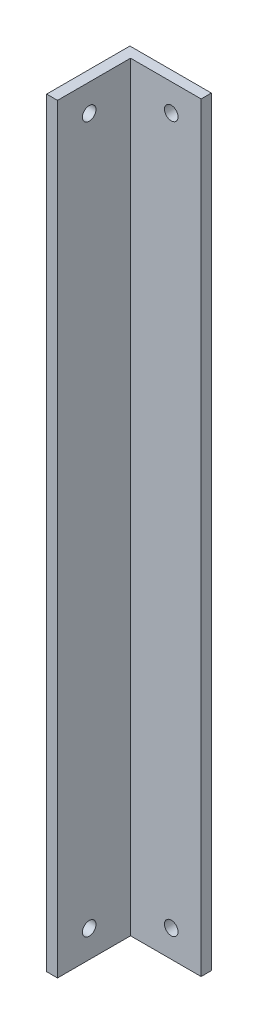
ISO-10303-21;
HEADER;
FILE_DESCRIPTION(('STEP AP214'),'2;1');
FILE_NAME('part.step','',(''),(''),'','','');
FILE_SCHEMA(('AUTOMOTIVE_DESIGN { 1 0 10303 214 1 1 1 1 }'));
ENDSEC;
DATA;
#1=APPLICATION_CONTEXT('core data for automotive mechanical design processes');
#2=APPLICATION_PROTOCOL_DEFINITION('international standard','automotive_design',2000,#1);
#3=PRODUCT_CONTEXT('',#1,'mechanical');
#4=PRODUCT('Part','Part','',(#3));
#5=PRODUCT_RELATED_PRODUCT_CATEGORY('part','',(#4));
#6=PRODUCT_DEFINITION_FORMATION('','',#4);
#7=PRODUCT_DEFINITION_CONTEXT('part definition',#1,'design');
#8=PRODUCT_DEFINITION('design','',#6,#7);
#9=PRODUCT_DEFINITION_SHAPE('','',#8);
#10=(LENGTH_UNIT() NAMED_UNIT(*) SI_UNIT(.MILLI.,.METRE.));
#11=(NAMED_UNIT(*) PLANE_ANGLE_UNIT() SI_UNIT($,.RADIAN.));
#12=(NAMED_UNIT(*) SI_UNIT($,.STERADIAN.) SOLID_ANGLE_UNIT());
#13=UNCERTAINTY_MEASURE_WITH_UNIT(LENGTH_MEASURE(1.E-05),#10,'distance_accuracy_value','');
#14=(GEOMETRIC_REPRESENTATION_CONTEXT(3) GLOBAL_UNCERTAINTY_ASSIGNED_CONTEXT((#13)) GLOBAL_UNIT_ASSIGNED_CONTEXT((#10,
#11,#12)) REPRESENTATION_CONTEXT('',''));
#15=CARTESIAN_POINT('',(0.,0.,0.));
#16=DIRECTION('',(0.,0.,1.));
#17=DIRECTION('',(1.,0.,0.));
#18=AXIS2_PLACEMENT_3D('',#15,#16,#17);
#19=CARTESIAN_POINT('',(-89.239761807091,280.,-232.24011731235));
#20=DIRECTION('',(-1.,0.,0.));
#21=DIRECTION('',(0.,0.,1.));
#22=AXIS2_PLACEMENT_3D('',#19,#20,#21);
#23=PLANE('',#22);
#24=DIRECTION('',(0.,0.,-1.));
#25=VECTOR('',#24,1.);
#26=CARTESIAN_POINT('',(-89.239761807091,0.,-232.24011731235));
#27=LINE('',#26,#25);
#28=CARTESIAN_POINT('',(-89.239761807091,0.,-228.470843435377));
#29=VERTEX_POINT('',#28);
#30=CARTESIAN_POINT('',(-89.239761807091,0.,-232.24011731235));
#31=VERTEX_POINT('',#30);
#32=EDGE_CURVE('E125',#29,#31,#27,.T.);
#33=ORIENTED_EDGE('',*,*,#32,.T.);
#34=DIRECTION('',(0.,-1.,0.));
#35=VECTOR('',#34,1.);
#36=CARTESIAN_POINT('',(-89.239761807091,280.,-232.24011731235));
#37=LINE('',#36,#35);
#38=CARTESIAN_POINT('',(-89.239761807091,280.,-232.24011731235));
#39=VERTEX_POINT('',#38);
#40=EDGE_CURVE('E11',#39,#31,#37,.T.);
#41=ORIENTED_EDGE('',*,*,#40,.F.);
#42=DIRECTION('',(0.,0.,-1.));
#43=VECTOR('',#42,1.);
#44=CARTESIAN_POINT('',(-89.239761807091,280.,-232.24011731235));
#45=LINE('',#44,#43);
#46=CARTESIAN_POINT('',(-89.239761807091,280.,-228.470843435377));
#47=VERTEX_POINT('',#46);
#48=EDGE_CURVE('E137',#47,#39,#45,.T.);
#49=ORIENTED_EDGE('',*,*,#48,.F.);
#50=DIRECTION('',(0.,-1.,0.));
#51=VECTOR('',#50,1.);
#52=CARTESIAN_POINT('',(-89.239761807091,280.,-228.470843435377));
#53=LINE('',#52,#51);
#54=EDGE_CURVE('E121',#47,#29,#53,.T.);
#55=ORIENTED_EDGE('',*,*,#54,.T.);
#56=EDGE_LOOP('',(#33,#41,#49,#55));
#57=FACE_BOUND('',#56,.T.);
#58=ADVANCED_FACE('F39',(#57),#23,.F.);
#59=CARTESIAN_POINT('',(-119.239761807091,280.,-232.24011731235));
#60=DIRECTION('',(0.,0.,1.));
#61=DIRECTION('',(1.,0.,0.));
#62=AXIS2_PLACEMENT_3D('',#59,#60,#61);
#63=PLANE('',#62);
#64=CARTESIAN_POINT('',(-100.239761807091,10.,-232.24011731235));
#65=DIRECTION('',(0.,0.,-1.));
#66=DIRECTION('',(-1.,0.,0.));
#67=AXIS2_PLACEMENT_3D('',#64,#65,#66);
#68=CIRCLE('',#67,2.49999999999999);
#69=CARTESIAN_POINT('',(-102.739761807091,10.,-232.24011731235));
#70=VERTEX_POINT('',#69);
#71=EDGE_CURVE('E265',#70,#70,#68,.T.);
#72=ORIENTED_EDGE('',*,*,#71,.F.);
#73=EDGE_LOOP('',(#72));
#74=FACE_BOUND('',#73,.T.);
#75=CARTESIAN_POINT('',(-100.239761807091,270.,-232.24011731235));
#76=DIRECTION('',(0.,0.,-1.));
#77=DIRECTION('',(-1.,0.,0.));
#78=AXIS2_PLACEMENT_3D('',#75,#76,#77);
#79=CIRCLE('',#78,2.49999999999999);
#80=CARTESIAN_POINT('',(-102.739761807091,270.,-232.24011731235));
#81=VERTEX_POINT('',#80);
#82=EDGE_CURVE('E156',#81,#81,#79,.T.);
#83=ORIENTED_EDGE('',*,*,#82,.F.);
#84=EDGE_LOOP('',(#83));
#85=FACE_BOUND('',#84,.T.);
#86=DIRECTION('',(-1.,0.,0.));
#87=VECTOR('',#86,1.);
#88=CARTESIAN_POINT('',(-119.239761807091,0.,-232.24011731235));
#89=LINE('',#88,#87);
#90=CARTESIAN_POINT('',(-119.239761807091,0.,-232.24011731235));
#91=VERTEX_POINT('',#90);
#92=EDGE_CURVE('E128',#31,#91,#89,.T.);
#93=ORIENTED_EDGE('',*,*,#92,.T.);
#94=DIRECTION('',(0.,-1.,0.));
#95=VECTOR('',#94,1.);
#96=CARTESIAN_POINT('',(-119.239761807091,280.,-232.24011731235));
#97=LINE('',#96,#95);
#98=CARTESIAN_POINT('',(-119.239761807091,280.,-232.24011731235));
#99=VERTEX_POINT('',#98);
#100=EDGE_CURVE('E48',#99,#91,#97,.T.);
#101=ORIENTED_EDGE('',*,*,#100,.F.);
#102=DIRECTION('',(-1.,0.,0.));
#103=VECTOR('',#102,1.);
#104=CARTESIAN_POINT('',(-119.239761807091,280.,-232.24011731235));
#105=LINE('',#104,#103);
#106=EDGE_CURVE('E94',#39,#99,#105,.T.);
#107=ORIENTED_EDGE('',*,*,#106,.F.);
#108=ORIENTED_EDGE('',*,*,#40,.T.);
#109=EDGE_LOOP('',(#93,#101,#107,#108));
#110=FACE_BOUND('',#109,.T.);
#111=ADVANCED_FACE('F165',(#74,#85,#110),#63,.F.);
#112=CARTESIAN_POINT('',(-119.239761807091,280.,-228.23121252951));
#113=DIRECTION('',(1.,0.,0.));
#114=DIRECTION('',(0.,0.,-1.));
#115=AXIS2_PLACEMENT_3D('',#112,#113,#114);
#116=PLANE('',#115);
#117=CARTESIAN_POINT('',(-119.239761807091,10.,-213.24011731235));
#118=DIRECTION('',(-1.,0.,0.));
#119=DIRECTION('',(0.,0.,1.));
#120=AXIS2_PLACEMENT_3D('',#117,#118,#119);
#121=CIRCLE('',#120,2.5);
#122=CARTESIAN_POINT('',(-119.239761807091,10.,-210.74011731235));
#123=VERTEX_POINT('',#122);
#124=EDGE_CURVE('E145',#123,#123,#121,.T.);
#125=ORIENTED_EDGE('',*,*,#124,.F.);
#126=EDGE_LOOP('',(#125));
#127=FACE_BOUND('',#126,.T.);
#128=CARTESIAN_POINT('',(-119.239761807091,270.,-213.24011731235));
#129=DIRECTION('',(-1.,0.,0.));
#130=DIRECTION('',(0.,0.,1.));
#131=AXIS2_PLACEMENT_3D('',#128,#129,#130);
#132=CIRCLE('',#131,2.5);
#133=CARTESIAN_POINT('',(-119.239761807091,270.,-210.74011731235));
#134=VERTEX_POINT('',#133);
#135=EDGE_CURVE('E144',#134,#134,#132,.T.);
#136=ORIENTED_EDGE('',*,*,#135,.F.);
#137=EDGE_LOOP('',(#136));
#138=FACE_BOUND('',#137,.T.);
#139=DIRECTION('',(0.,0.,1.));
#140=VECTOR('',#139,1.);
#141=CARTESIAN_POINT('',(-119.239761807091,0.,-228.23121252951));
#142=LINE('',#141,#140);
#143=CARTESIAN_POINT('',(-119.239761807091,0.,-201.561077593746));
#144=VERTEX_POINT('',#143);
#145=EDGE_CURVE('E132',#91,#144,#142,.T.);
#146=ORIENTED_EDGE('',*,*,#145,.T.);
#147=DIRECTION('',(0.,-1.,0.));
#148=VECTOR('',#147,1.);
#149=CARTESIAN_POINT('',(-119.239761807091,280.,-201.561077593746));
#150=LINE('',#149,#148);
#151=CARTESIAN_POINT('',(-119.239761807091,280.,-201.561077593746));
#152=VERTEX_POINT('',#151);
#153=EDGE_CURVE('E116',#152,#144,#150,.T.);
#154=ORIENTED_EDGE('',*,*,#153,.F.);
#155=DIRECTION('',(0.,0.,1.));
#156=VECTOR('',#155,1.);
#157=CARTESIAN_POINT('',(-119.239761807091,280.,-232.24011731235));
#158=LINE('',#157,#156);
#159=EDGE_CURVE('E107',#99,#152,#158,.T.);
#160=ORIENTED_EDGE('',*,*,#159,.F.);
#161=ORIENTED_EDGE('',*,*,#100,.T.);
#162=EDGE_LOOP('',(#146,#154,#160,#161));
#163=FACE_BOUND('',#162,.T.);
#164=ADVANCED_FACE('F167',(#127,#138,#163),#116,.F.);
#165=CARTESIAN_POINT('',(-119.239761807091,280.,-201.561077593746));
#166=DIRECTION('',(0.,0.,-1.));
#167=DIRECTION('',(-1.,0.,0.));
#168=AXIS2_PLACEMENT_3D('',#165,#166,#167);
#169=PLANE('',#168);
#170=DIRECTION('',(1.,0.,0.));
#171=VECTOR('',#170,1.);
#172=CARTESIAN_POINT('',(-119.239761807091,0.,-201.561077593746));
#173=LINE('',#172,#171);
#174=CARTESIAN_POINT('',(-115.239761807091,0.,-201.561077593746));
#175=VERTEX_POINT('',#174);
#176=EDGE_CURVE('E115',#144,#175,#173,.T.);
#177=ORIENTED_EDGE('',*,*,#176,.T.);
#178=DIRECTION('',(0.,-1.,0.));
#179=VECTOR('',#178,1.);
#180=CARTESIAN_POINT('',(-115.239761807091,280.,-201.561077593746));
#181=LINE('',#180,#179);
#182=CARTESIAN_POINT('',(-115.239761807091,280.,-201.561077593746));
#183=VERTEX_POINT('',#182);
#184=EDGE_CURVE('E112',#183,#175,#181,.T.);
#185=ORIENTED_EDGE('',*,*,#184,.F.);
#186=DIRECTION('',(1.,0.,0.));
#187=VECTOR('',#186,1.);
#188=CARTESIAN_POINT('',(-119.239761807091,280.,-201.561077593746));
#189=LINE('',#188,#187);
#190=EDGE_CURVE('E101',#152,#183,#189,.T.);
#191=ORIENTED_EDGE('',*,*,#190,.F.);
#192=ORIENTED_EDGE('',*,*,#153,.T.);
#193=EDGE_LOOP('',(#177,#185,#191,#192));
#194=FACE_BOUND('',#193,.T.);
#195=ADVANCED_FACE('F113',(#194),#169,.F.);
#196=CARTESIAN_POINT('',(-115.239761807091,280.,-201.561077593746));
#197=DIRECTION('',(-1.,0.,0.));
#198=DIRECTION('',(0.,0.,1.));
#199=AXIS2_PLACEMENT_3D('',#196,#197,#198);
#200=PLANE('',#199);
#201=CARTESIAN_POINT('',(-115.239761807091,10.,-213.24011731235));
#202=DIRECTION('',(-1.,0.,0.));
#203=DIRECTION('',(0.,0.,1.));
#204=AXIS2_PLACEMENT_3D('',#201,#202,#203);
#205=CIRCLE('',#204,2.5);
#206=CARTESIAN_POINT('',(-115.239761807091,10.,-210.74011731235));
#207=VERTEX_POINT('',#206);
#208=EDGE_CURVE('E142',#207,#207,#205,.T.);
#209=ORIENTED_EDGE('',*,*,#208,.T.);
#210=EDGE_LOOP('',(#209));
#211=FACE_BOUND('',#210,.T.);
#212=CARTESIAN_POINT('',(-115.239761807091,270.,-213.24011731235));
#213=DIRECTION('',(-1.,0.,0.));
#214=DIRECTION('',(0.,0.,1.));
#215=AXIS2_PLACEMENT_3D('',#212,#213,#214);
#216=CIRCLE('',#215,2.5);
#217=CARTESIAN_POINT('',(-115.239761807091,270.,-210.74011731235));
#218=VERTEX_POINT('',#217);
#219=EDGE_CURVE('E129',#218,#218,#216,.T.);
#220=ORIENTED_EDGE('',*,*,#219,.T.);
#221=EDGE_LOOP('',(#220));
#222=FACE_BOUND('',#221,.T.);
#223=DIRECTION('',(0.,0.,-1.));
#224=VECTOR('',#223,1.);
#225=CARTESIAN_POINT('',(-115.239761807091,0.,-201.561077593746));
#226=LINE('',#225,#224);
#227=CARTESIAN_POINT('',(-115.239761807091,0.,-228.470843435377));
#228=VERTEX_POINT('',#227);
#229=EDGE_CURVE('E80',#175,#228,#226,.T.);
#230=ORIENTED_EDGE('',*,*,#229,.T.);
#231=DIRECTION('',(0.,-1.,0.));
#232=VECTOR('',#231,1.);
#233=CARTESIAN_POINT('',(-115.239761807091,280.,-228.470843435377));
#234=LINE('',#233,#232);
#235=CARTESIAN_POINT('',(-115.239761807091,280.,-228.470843435377));
#236=VERTEX_POINT('',#235);
#237=EDGE_CURVE('E117',#236,#228,#234,.T.);
#238=ORIENTED_EDGE('',*,*,#237,.F.);
#239=DIRECTION('',(0.,0.,-1.));
#240=VECTOR('',#239,1.);
#241=CARTESIAN_POINT('',(-115.239761807091,280.,-201.561077593746));
#242=LINE('',#241,#240);
#243=EDGE_CURVE('E105',#183,#236,#242,.T.);
#244=ORIENTED_EDGE('',*,*,#243,.F.);
#245=ORIENTED_EDGE('',*,*,#184,.T.);
#246=EDGE_LOOP('',(#230,#238,#244,#245));
#247=FACE_BOUND('',#246,.T.);
#248=ADVANCED_FACE('F119',(#211,#222,#247),#200,.F.);
#249=CARTESIAN_POINT('',(-115.239761807091,280.,-228.470843435377));
#250=DIRECTION('',(0.,0.,-1.));
#251=DIRECTION('',(-1.,0.,0.));
#252=AXIS2_PLACEMENT_3D('',#249,#250,#251);
#253=PLANE('',#252);
#254=CARTESIAN_POINT('',(-100.239761807091,10.,-228.470843435377));
#255=DIRECTION('',(0.,0.,-1.));
#256=DIRECTION('',(-1.,0.,0.));
#257=AXIS2_PLACEMENT_3D('',#254,#255,#256);
#258=CIRCLE('',#257,2.5);
#259=CARTESIAN_POINT('',(-102.739761807091,10.,-228.470843435377));
#260=VERTEX_POINT('',#259);
#261=EDGE_CURVE('E42',#260,#260,#258,.T.);
#262=ORIENTED_EDGE('',*,*,#261,.T.);
#263=EDGE_LOOP('',(#262));
#264=FACE_BOUND('',#263,.T.);
#265=CARTESIAN_POINT('',(-100.239761807091,270.,-228.470843435377));
#266=DIRECTION('',(0.,0.,-1.));
#267=DIRECTION('',(-1.,0.,0.));
#268=AXIS2_PLACEMENT_3D('',#265,#266,#267);
#269=CIRCLE('',#268,2.5);
#270=CARTESIAN_POINT('',(-102.739761807091,270.,-228.470843435377));
#271=VERTEX_POINT('',#270);
#272=EDGE_CURVE('E151',#271,#271,#269,.T.);
#273=ORIENTED_EDGE('',*,*,#272,.T.);
#274=EDGE_LOOP('',(#273));
#275=FACE_BOUND('',#274,.T.);
#276=DIRECTION('',(1.,0.,0.));
#277=VECTOR('',#276,1.);
#278=CARTESIAN_POINT('',(-115.239761807091,0.,-228.470843435377));
#279=LINE('',#278,#277);
#280=EDGE_CURVE('E86',#228,#29,#279,.T.);
#281=ORIENTED_EDGE('',*,*,#280,.T.);
#282=ORIENTED_EDGE('',*,*,#54,.F.);
#283=DIRECTION('',(1.,0.,0.));
#284=VECTOR('',#283,1.);
#285=CARTESIAN_POINT('',(-115.239761807091,280.,-228.470843435377));
#286=LINE('',#285,#284);
#287=EDGE_CURVE('E57',#236,#47,#286,.T.);
#288=ORIENTED_EDGE('',*,*,#287,.F.);
#289=ORIENTED_EDGE('',*,*,#237,.T.);
#290=EDGE_LOOP('',(#281,#282,#288,#289));
#291=FACE_BOUND('',#290,.T.);
#292=ADVANCED_FACE('F172',(#264,#275,#291),#253,.F.);
#293=CARTESIAN_POINT('',(0.,280.,0.));
#294=DIRECTION('',(0.,1.,0.));
#295=DIRECTION('',(0.,0.,1.));
#296=AXIS2_PLACEMENT_3D('',#293,#294,#295);
#297=PLANE('',#296);
#298=ORIENTED_EDGE('',*,*,#48,.T.);
#299=ORIENTED_EDGE('',*,*,#106,.T.);
#300=ORIENTED_EDGE('',*,*,#159,.T.);
#301=ORIENTED_EDGE('',*,*,#190,.T.);
#302=ORIENTED_EDGE('',*,*,#243,.T.);
#303=ORIENTED_EDGE('',*,*,#287,.T.);
#304=EDGE_LOOP('',(#298,#299,#300,#301,#302,#303));
#305=FACE_BOUND('',#304,.T.);
#306=ADVANCED_FACE('F103',(#305),#297,.T.);
#307=CARTESIAN_POINT('',(0.,0.,0.));
#308=DIRECTION('',(0.,1.,0.));
#309=DIRECTION('',(0.,0.,1.));
#310=AXIS2_PLACEMENT_3D('',#307,#308,#309);
#311=PLANE('',#310);
#312=ORIENTED_EDGE('',*,*,#32,.F.);
#313=ORIENTED_EDGE('',*,*,#280,.F.);
#314=ORIENTED_EDGE('',*,*,#229,.F.);
#315=ORIENTED_EDGE('',*,*,#176,.F.);
#316=ORIENTED_EDGE('',*,*,#145,.F.);
#317=ORIENTED_EDGE('',*,*,#92,.F.);
#318=EDGE_LOOP('',(#312,#313,#314,#315,#316,#317));
#319=FACE_BOUND('',#318,.T.);
#320=ADVANCED_FACE('F170',(#319),#311,.F.);
#321=CARTESIAN_POINT('',(-119.239761807091,270.,-213.24011731235));
#322=DIRECTION('',(-1.,0.,0.));
#323=DIRECTION('',(0.,0.,1.));
#324=AXIS2_PLACEMENT_3D('',#321,#322,#323);
#325=CYLINDRICAL_SURFACE('',#324,2.5);
#326=ORIENTED_EDGE('',*,*,#135,.T.);
#327=EDGE_LOOP('',(#326));
#328=FACE_BOUND('',#327,.T.);
#329=ORIENTED_EDGE('',*,*,#219,.F.);
#330=EDGE_LOOP('',(#329));
#331=FACE_BOUND('',#330,.T.);
#332=ADVANCED_FACE('F216',(#328,#331),#325,.F.);
#333=CARTESIAN_POINT('',(-119.239761807091,10.,-213.24011731235));
#334=DIRECTION('',(-1.,0.,0.));
#335=DIRECTION('',(0.,0.,1.));
#336=AXIS2_PLACEMENT_3D('',#333,#334,#335);
#337=CYLINDRICAL_SURFACE('',#336,2.5);
#338=ORIENTED_EDGE('',*,*,#124,.T.);
#339=EDGE_LOOP('',(#338));
#340=FACE_BOUND('',#339,.T.);
#341=ORIENTED_EDGE('',*,*,#208,.F.);
#342=EDGE_LOOP('',(#341));
#343=FACE_BOUND('',#342,.T.);
#344=ADVANCED_FACE('F231',(#340,#343),#337,.F.);
#345=CARTESIAN_POINT('',(-100.239761807091,270.,-232.24011731235));
#346=DIRECTION('',(0.,0.,-1.));
#347=DIRECTION('',(-1.,0.,0.));
#348=AXIS2_PLACEMENT_3D('',#345,#346,#347);
#349=CYLINDRICAL_SURFACE('',#348,2.5);
#350=ORIENTED_EDGE('',*,*,#82,.T.);
#351=EDGE_LOOP('',(#350));
#352=FACE_BOUND('',#351,.T.);
#353=ORIENTED_EDGE('',*,*,#272,.F.);
#354=EDGE_LOOP('',(#353));
#355=FACE_BOUND('',#354,.T.);
#356=ADVANCED_FACE('F239',(#352,#355),#349,.F.);
#357=CARTESIAN_POINT('',(-100.239761807091,10.,-232.24011731235));
#358=DIRECTION('',(0.,0.,-1.));
#359=DIRECTION('',(-1.,0.,0.));
#360=AXIS2_PLACEMENT_3D('',#357,#358,#359);
#361=CYLINDRICAL_SURFACE('',#360,2.5);
#362=ORIENTED_EDGE('',*,*,#71,.T.);
#363=EDGE_LOOP('',(#362));
#364=FACE_BOUND('',#363,.T.);
#365=ORIENTED_EDGE('',*,*,#261,.F.);
#366=EDGE_LOOP('',(#365));
#367=FACE_BOUND('',#366,.T.);
#368=ADVANCED_FACE('F250',(#364,#367),#361,.F.);
#369=CLOSED_SHELL('',(#58,#111,#164,#195,#248,#292,#306,#320,#332,#344,#356,#368));
#370=MANIFOLD_SOLID_BREP('B2',#369);
#371=ADVANCED_BREP_SHAPE_REPRESENTATION('',(#18,#370),#14);
#372=SHAPE_DEFINITION_REPRESENTATION(#9,#371);
ENDSEC;
END-ISO-10303-21;
